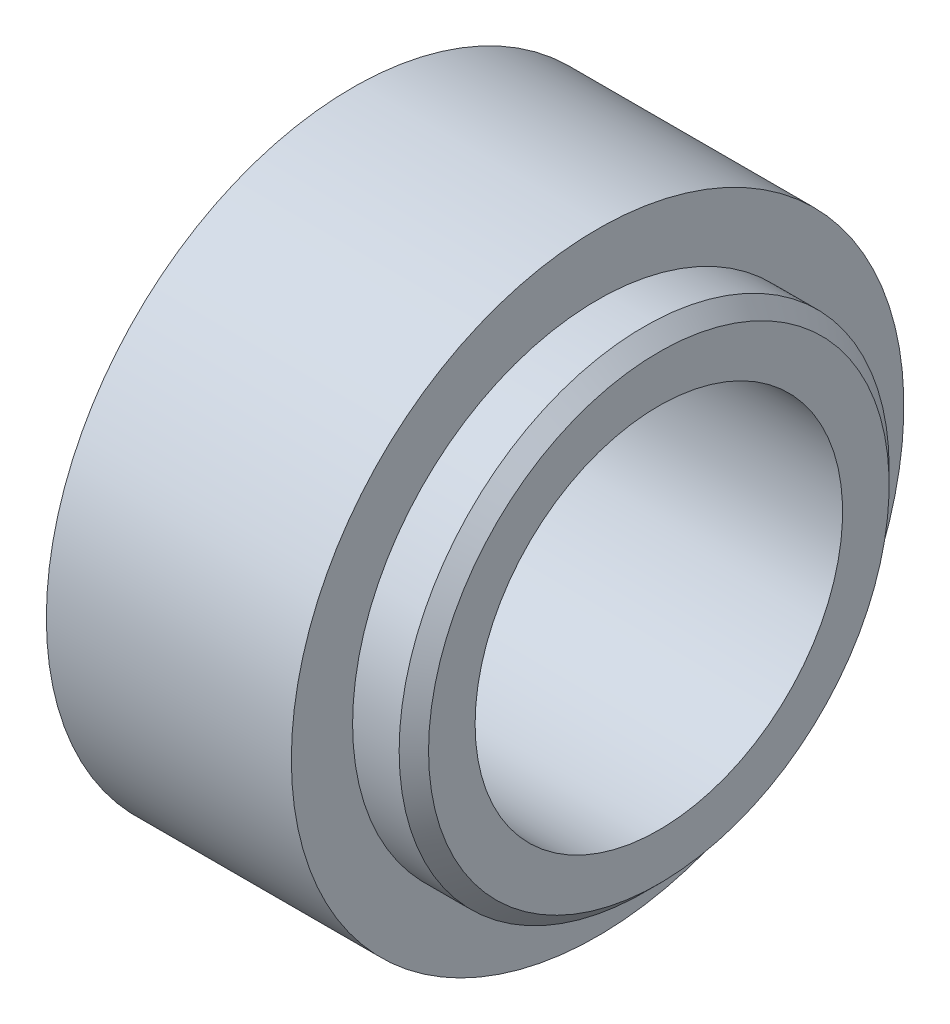
ISO-10303-21;
HEADER;
FILE_DESCRIPTION(('STEP AP214'),'2;1');
FILE_NAME('part.step','',(''),(''),'','','');
FILE_SCHEMA(('AUTOMOTIVE_DESIGN { 1 0 10303 214 1 1 1 1 }'));
ENDSEC;
DATA;
#1=APPLICATION_CONTEXT('core data for automotive mechanical design processes');
#2=APPLICATION_PROTOCOL_DEFINITION('international standard','automotive_design',2000,#1);
#3=PRODUCT_CONTEXT('',#1,'mechanical');
#4=PRODUCT('Part','Part','',(#3));
#5=PRODUCT_RELATED_PRODUCT_CATEGORY('part','',(#4));
#6=PRODUCT_DEFINITION_FORMATION('','',#4);
#7=PRODUCT_DEFINITION_CONTEXT('part definition',#1,'design');
#8=PRODUCT_DEFINITION('design','',#6,#7);
#9=PRODUCT_DEFINITION_SHAPE('','',#8);
#10=(LENGTH_UNIT() NAMED_UNIT(*) SI_UNIT(.MILLI.,.METRE.));
#11=(NAMED_UNIT(*) PLANE_ANGLE_UNIT() SI_UNIT($,.RADIAN.));
#12=(NAMED_UNIT(*) SI_UNIT($,.STERADIAN.) SOLID_ANGLE_UNIT());
#13=UNCERTAINTY_MEASURE_WITH_UNIT(LENGTH_MEASURE(1.E-05),#10,'distance_accuracy_value','');
#14=(GEOMETRIC_REPRESENTATION_CONTEXT(3) GLOBAL_UNCERTAINTY_ASSIGNED_CONTEXT((#13)) GLOBAL_UNIT_ASSIGNED_CONTEXT((#10,
#11,#12)) REPRESENTATION_CONTEXT('',''));
#15=CARTESIAN_POINT('',(0.,0.,0.));
#16=DIRECTION('',(0.,0.,1.));
#17=DIRECTION('',(1.,0.,0.));
#18=AXIS2_PLACEMENT_3D('',#15,#16,#17);
#19=CARTESIAN_POINT('',(0.,0.,0.));
#20=DIRECTION('',(1.,0.,0.));
#21=DIRECTION('',(0.,0.,-1.));
#22=AXIS2_PLACEMENT_3D('',#19,#20,#21);
#23=PLANE('',#22);
#24=CARTESIAN_POINT('',(0.,0.,0.));
#25=DIRECTION('',(1.,0.,0.));
#26=DIRECTION('',(0.,0.,-1.));
#27=AXIS2_PLACEMENT_3D('',#24,#25,#26);
#28=CIRCLE('',#27,20.574);
#29=CARTESIAN_POINT('',(0.,0.,-20.574));
#30=VERTEX_POINT('',#29);
#31=EDGE_CURVE('E46',#30,#30,#28,.T.);
#32=ORIENTED_EDGE('',*,*,#31,.T.);
#33=EDGE_LOOP('',(#32));
#34=FACE_BOUND('',#33,.T.);
#35=CARTESIAN_POINT('',(0.,0.,0.));
#36=DIRECTION('',(-1.,0.,0.));
#37=DIRECTION('',(0.,0.,1.));
#38=AXIS2_PLACEMENT_3D('',#35,#36,#37);
#39=CIRCLE('',#38,31.75);
#40=CARTESIAN_POINT('',(0.,0.,31.75));
#41=VERTEX_POINT('',#40);
#42=EDGE_CURVE('E55',#41,#41,#39,.T.);
#43=ORIENTED_EDGE('',*,*,#42,.T.);
#44=EDGE_LOOP('',(#43));
#45=FACE_BOUND('',#44,.T.);
#46=ADVANCED_FACE('F34',(#34,#45),#23,.F.);
#47=CARTESIAN_POINT('',(-14.1419213973799,0.,0.));
#48=DIRECTION('',(-1.,0.,0.));
#49=DIRECTION('',(0.,0.,1.));
#50=AXIS2_PLACEMENT_3D('',#47,#48,#49);
#51=CYLINDRICAL_SURFACE('',#50,31.75);
#52=ORIENTED_EDGE('',*,*,#42,.F.);
#53=EDGE_LOOP('',(#52));
#54=FACE_BOUND('',#53,.T.);
#55=CARTESIAN_POINT('',(25.4,0.,0.));
#56=DIRECTION('',(-1.,0.,0.));
#57=DIRECTION('',(0.,0.,1.));
#58=AXIS2_PLACEMENT_3D('',#55,#56,#57);
#59=CIRCLE('',#58,31.75);
#60=CARTESIAN_POINT('',(25.4,0.,31.75));
#61=VERTEX_POINT('',#60);
#62=EDGE_CURVE('E58',#61,#61,#59,.T.);
#63=ORIENTED_EDGE('',*,*,#62,.T.);
#64=EDGE_LOOP('',(#63));
#65=FACE_BOUND('',#64,.T.);
#66=ADVANCED_FACE('F83',(#54,#65),#51,.T.);
#67=CARTESIAN_POINT('',(25.4,31.75,0.));
#68=DIRECTION('',(-1.,0.,0.));
#69=DIRECTION('',(0.,0.,1.));
#70=AXIS2_PLACEMENT_3D('',#67,#68,#69);
#71=PLANE('',#70);
#72=ORIENTED_EDGE('',*,*,#62,.F.);
#73=EDGE_LOOP('',(#72));
#74=FACE_BOUND('',#73,.T.);
#75=CARTESIAN_POINT('',(25.4,0.,0.));
#76=DIRECTION('',(-1.,0.,0.));
#77=DIRECTION('',(0.,0.,1.));
#78=AXIS2_PLACEMENT_3D('',#75,#76,#77);
#79=CIRCLE('',#78,25.4);
#80=CARTESIAN_POINT('',(25.4,0.,25.4));
#81=VERTEX_POINT('',#80);
#82=EDGE_CURVE('E61',#81,#81,#79,.T.);
#83=ORIENTED_EDGE('',*,*,#82,.T.);
#84=EDGE_LOOP('',(#83));
#85=FACE_BOUND('',#84,.T.);
#86=ADVANCED_FACE('F89',(#74,#85),#71,.F.);
#87=CARTESIAN_POINT('',(-14.1419213973799,0.,0.));
#88=DIRECTION('',(-1.,0.,0.));
#89=DIRECTION('',(0.,0.,1.));
#90=AXIS2_PLACEMENT_3D('',#87,#88,#89);
#91=CYLINDRICAL_SURFACE('',#90,25.4);
#92=CARTESIAN_POINT('',(30.226,0.,0.));
#93=DIRECTION('',(-1.,0.,0.));
#94=DIRECTION('',(0.,0.,1.));
#95=AXIS2_PLACEMENT_3D('',#92,#93,#94);
#96=CIRCLE('',#95,25.4);
#97=CARTESIAN_POINT('',(30.226,0.,25.4));
#98=VERTEX_POINT('',#97);
#99=EDGE_CURVE('E42',#98,#98,#96,.T.);
#100=ORIENTED_EDGE('',*,*,#99,.T.);
#101=EDGE_LOOP('',(#100));
#102=FACE_BOUND('',#101,.T.);
#103=ORIENTED_EDGE('',*,*,#82,.F.);
#104=EDGE_LOOP('',(#103));
#105=FACE_BOUND('',#104,.T.);
#106=ADVANCED_FACE('F80',(#102,#105),#91,.T.);
#107=CARTESIAN_POINT('',(31.75,25.4,0.));
#108=DIRECTION('',(-1.,0.,0.));
#109=DIRECTION('',(0.,0.,1.));
#110=AXIS2_PLACEMENT_3D('',#107,#108,#109);
#111=PLANE('',#110);
#112=CARTESIAN_POINT('',(31.75,0.,0.));
#113=DIRECTION('',(-1.,0.,0.));
#114=DIRECTION('',(0.,0.,1.));
#115=AXIS2_PLACEMENT_3D('',#112,#113,#114);
#116=CIRCLE('',#115,23.876);
#117=CARTESIAN_POINT('',(31.75,0.,23.876));
#118=VERTEX_POINT('',#117);
#119=EDGE_CURVE('E10',#118,#118,#116,.F.);
#120=ORIENTED_EDGE('',*,*,#119,.T.);
#121=EDGE_LOOP('',(#120));
#122=FACE_BOUND('',#121,.T.);
#123=CARTESIAN_POINT('',(31.75,0.,0.));
#124=DIRECTION('',(-1.,0.,0.));
#125=DIRECTION('',(0.,0.,1.));
#126=AXIS2_PLACEMENT_3D('',#123,#124,#125);
#127=CIRCLE('',#126,19.05);
#128=CARTESIAN_POINT('',(31.75,0.,19.05));
#129=VERTEX_POINT('',#128);
#130=EDGE_CURVE('E64',#129,#129,#127,.T.);
#131=ORIENTED_EDGE('',*,*,#130,.T.);
#132=EDGE_LOOP('',(#131));
#133=FACE_BOUND('',#132,.T.);
#134=ADVANCED_FACE('F68',(#122,#133),#111,.F.);
#135=CARTESIAN_POINT('',(31.75,0.,0.));
#136=DIRECTION('',(-1.,0.,0.));
#137=DIRECTION('',(0.,0.,1.));
#138=AXIS2_PLACEMENT_3D('',#135,#136,#137);
#139=CYLINDRICAL_SURFACE('',#138,19.05);
#140=CARTESIAN_POINT('',(1.52399999999997,0.,0.));
#141=DIRECTION('',(1.,0.,0.));
#142=DIRECTION('',(0.,0.,-1.));
#143=AXIS2_PLACEMENT_3D('',#140,#141,#142);
#144=CIRCLE('',#143,19.05);
#145=CARTESIAN_POINT('',(1.52399999999997,0.,-19.05));
#146=VERTEX_POINT('',#145);
#147=EDGE_CURVE('E50',#146,#146,#144,.F.);
#148=ORIENTED_EDGE('',*,*,#147,.T.);
#149=EDGE_LOOP('',(#148));
#150=FACE_BOUND('',#149,.T.);
#151=ORIENTED_EDGE('',*,*,#130,.F.);
#152=EDGE_LOOP('',(#151));
#153=FACE_BOUND('',#152,.T.);
#154=ADVANCED_FACE('F70',(#150,#153),#139,.F.);
#155=CARTESIAN_POINT('',(1.52399999999997,0.,0.));
#156=DIRECTION('',(-1.,0.,0.));
#157=DIRECTION('',(0.,0.,1.));
#158=AXIS2_PLACEMENT_3D('',#155,#156,#157);
#159=CONICAL_SURFACE('',#158,19.05,0.785398163397453);
#160=ORIENTED_EDGE('',*,*,#31,.F.);
#161=EDGE_LOOP('',(#160));
#162=FACE_BOUND('',#161,.T.);
#163=ORIENTED_EDGE('',*,*,#147,.F.);
#164=EDGE_LOOP('',(#163));
#165=FACE_BOUND('',#164,.T.);
#166=ADVANCED_FACE('F72',(#162,#165),#159,.F.);
#167=CARTESIAN_POINT('',(30.226,0.,0.));
#168=DIRECTION('',(-1.,0.,0.));
#169=DIRECTION('',(0.,0.,1.));
#170=AXIS2_PLACEMENT_3D('',#167,#168,#169);
#171=CONICAL_SURFACE('',#170,25.4,0.785398163397451);
#172=CARTESIAN_POINT('',(31.75,0.,23.876));
#173=CARTESIAN_POINT('',(31.734125,0.,23.891875));
#174=CARTESIAN_POINT('',(31.71825,0.,23.90775));
#175=CARTESIAN_POINT('',(31.6865,0.,23.9395));
#176=CARTESIAN_POINT('',(31.670625,0.,23.955375));
#177=CARTESIAN_POINT('',(31.638875,0.,23.987125));
#178=CARTESIAN_POINT('',(31.623,0.,24.003));
#179=CARTESIAN_POINT('',(31.59125,0.,24.03475));
#180=CARTESIAN_POINT('',(31.575375,0.,24.050625));
#181=CARTESIAN_POINT('',(31.543625,0.,24.082375));
#182=CARTESIAN_POINT('',(31.52775,0.,24.09825));
#183=CARTESIAN_POINT('',(31.496,0.,24.13));
#184=CARTESIAN_POINT('',(31.480125,0.,24.145875));
#185=CARTESIAN_POINT('',(31.448375,0.,24.177625));
#186=CARTESIAN_POINT('',(31.4325,0.,24.1935));
#187=CARTESIAN_POINT('',(31.40075,0.,24.22525));
#188=CARTESIAN_POINT('',(31.384875,0.,24.241125));
#189=CARTESIAN_POINT('',(31.353125,0.,24.272875));
#190=CARTESIAN_POINT('',(31.33725,0.,24.28875));
#191=CARTESIAN_POINT('',(31.3055,0.,24.3205));
#192=CARTESIAN_POINT('',(31.289625,0.,24.336375));
#193=CARTESIAN_POINT('',(31.257875,0.,24.368125));
#194=CARTESIAN_POINT('',(31.242,0.,24.384));
#195=CARTESIAN_POINT('',(31.21025,0.,24.41575));
#196=CARTESIAN_POINT('',(31.194375,0.,24.431625));
#197=CARTESIAN_POINT('',(31.162625,0.,24.463375));
#198=CARTESIAN_POINT('',(31.14675,0.,24.47925));
#199=CARTESIAN_POINT('',(31.115,0.,24.511));
#200=CARTESIAN_POINT('',(31.099125,0.,24.526875));
#201=CARTESIAN_POINT('',(31.067375,0.,24.558625));
#202=CARTESIAN_POINT('',(31.0515,0.,24.5745));
#203=CARTESIAN_POINT('',(31.01975,0.,24.60625));
#204=CARTESIAN_POINT('',(31.003875,0.,24.622125));
#205=CARTESIAN_POINT('',(30.972125,0.,24.653875));
#206=CARTESIAN_POINT('',(30.95625,0.,24.66975));
#207=CARTESIAN_POINT('',(30.9245,0.,24.7015));
#208=CARTESIAN_POINT('',(30.908625,0.,24.717375));
#209=CARTESIAN_POINT('',(30.876875,0.,24.749125));
#210=CARTESIAN_POINT('',(30.861,0.,24.765));
#211=CARTESIAN_POINT('',(30.82925,0.,24.79675));
#212=CARTESIAN_POINT('',(30.813375,0.,24.812625));
#213=CARTESIAN_POINT('',(30.781625,0.,24.844375));
#214=CARTESIAN_POINT('',(30.76575,0.,24.86025));
#215=CARTESIAN_POINT('',(30.734,0.,24.892));
#216=CARTESIAN_POINT('',(30.718125,0.,24.907875));
#217=CARTESIAN_POINT('',(30.686375,0.,24.939625));
#218=CARTESIAN_POINT('',(30.6705,0.,24.9555));
#219=CARTESIAN_POINT('',(30.63875,0.,24.98725));
#220=CARTESIAN_POINT('',(30.622875,0.,25.003125));
#221=CARTESIAN_POINT('',(30.591125,0.,25.034875));
#222=CARTESIAN_POINT('',(30.57525,0.,25.05075));
#223=CARTESIAN_POINT('',(30.5435,0.,25.0825));
#224=CARTESIAN_POINT('',(30.527625,0.,25.098375));
#225=CARTESIAN_POINT('',(30.495875,0.,25.130125));
#226=CARTESIAN_POINT('',(30.48,0.,25.146));
#227=CARTESIAN_POINT('',(30.44825,0.,25.17775));
#228=CARTESIAN_POINT('',(30.432375,0.,25.193625));
#229=CARTESIAN_POINT('',(30.400625,0.,25.225375));
#230=CARTESIAN_POINT('',(30.38475,0.,25.24125));
#231=CARTESIAN_POINT('',(30.353,0.,25.273));
#232=CARTESIAN_POINT('',(30.337125,0.,25.288875));
#233=CARTESIAN_POINT('',(30.305375,0.,25.320625));
#234=CARTESIAN_POINT('',(30.2895,0.,25.3365));
#235=CARTESIAN_POINT('',(30.25775,0.,25.36825));
#236=CARTESIAN_POINT('',(30.241875,0.,25.384125));
#237=CARTESIAN_POINT('',(30.226,0.,25.4));
#238=B_SPLINE_CURVE_WITH_KNOTS('',3,(#172,#173,#174,#175,#176,#177,#178,#179,#180,#181,#182,
#183,#184,#185,#186,#187,#188,#189,#190,#191,#192,#193,#194,#195,#196,#197,#198,#199,#200,#201,
#202,#203,#204,#205,#206,#207,#208,#209,#210,#211,#212,#213,#214,#215,#216,#217,#218,#219,#220,
#221,#222,#223,#224,#225,#226,#227,#228,#229,#230,#231,#232,#233,#234,#235,#236,#237),
.UNSPECIFIED.,.F.,.F.,(4,2,2,2,2,2,2,2,2,2,2,2,2,2,2,2,2,2,2,2,2,2,2,2,2,2,2,2,2,2,2,2,4),(0.,
0.0673519209080198,0.134703841816042,0.202055762724064,0.269407683632079,0.336759604540101,
0.404111525448121,0.471463446356143,0.538815367264163,0.60616728817218,0.673519209080202,
0.740871129988222,0.808223050896242,0.875574971804262,0.942926892712282,1.0102788136203,
1.07763073452832,1.14498265543634,1.21233457634436,1.27968649725238,1.3470384181604,
1.41439033906842,1.48174225997644,1.54909418088446,1.61644610179248,1.6837980227005,
1.75114994360852,1.81850186451654,1.88585378542456,1.95320570633258,2.0205576272406,
2.08790954814862,2.15526146905664),.UNSPECIFIED.);
#239=EDGE_CURVE('BSEAM37',#118,#98,#238,.T.);
#240=ORIENTED_EDGE('',*,*,#119,.F.);
#241=ORIENTED_EDGE('',*,*,#99,.F.);
#242=ORIENTED_EDGE('',*,*,#239,.T.);
#243=ORIENTED_EDGE('',*,*,#239,.F.);
#244=EDGE_LOOP('',(#240,#242,#241,#243));
#245=FACE_BOUND('',#244,.T.);
#246=ADVANCED_FACE('F37',(#245),#171,.T.);
#247=CLOSED_SHELL('',(#46,#66,#86,#106,#134,#154,#166,#246));
#248=MANIFOLD_SOLID_BREP('B2',#247);
#249=ADVANCED_BREP_SHAPE_REPRESENTATION('',(#18,#248),#14);
#250=SHAPE_DEFINITION_REPRESENTATION(#9,#249);
ENDSEC;
END-ISO-10303-21;
